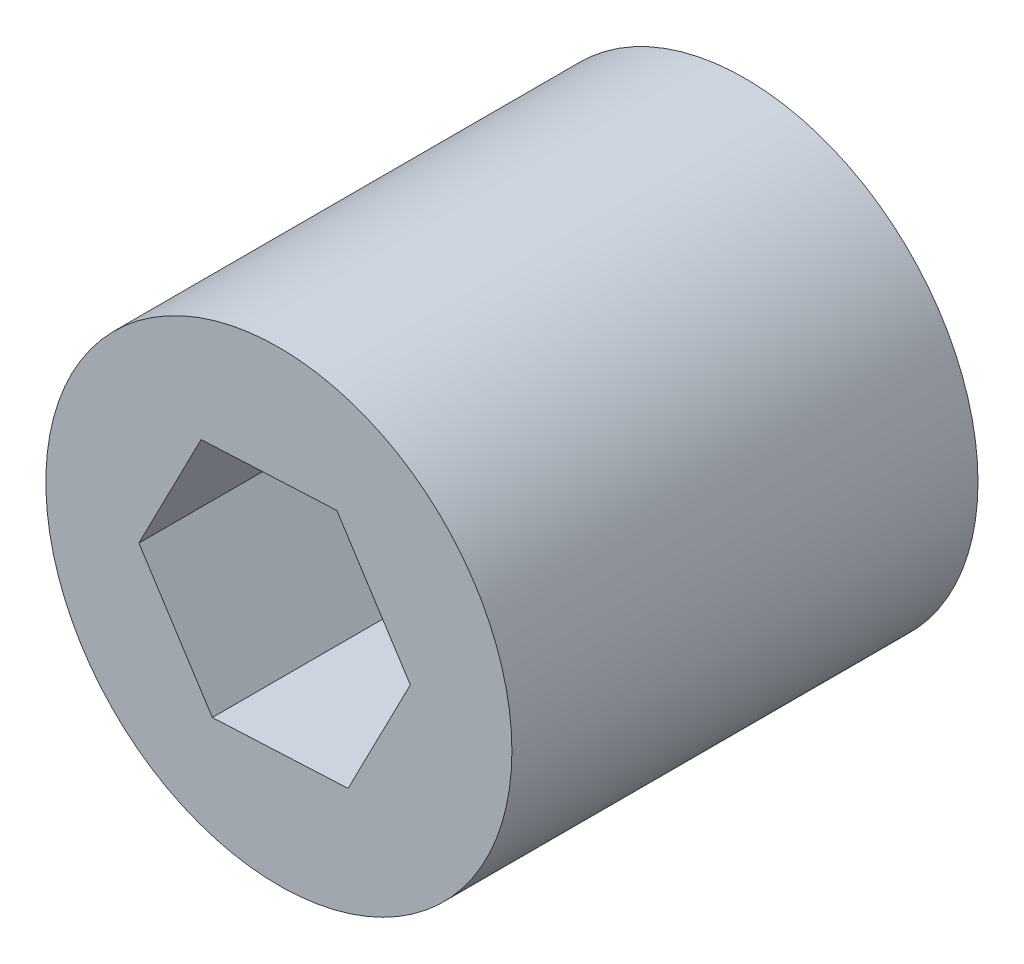
ISO-10303-21;
HEADER;
FILE_DESCRIPTION(('STEP AP214'),'2;1');
FILE_NAME('part.step','',(''),(''),'','','');
FILE_SCHEMA(('AUTOMOTIVE_DESIGN { 1 0 10303 214 1 1 1 1 }'));
ENDSEC;
DATA;
#1=APPLICATION_CONTEXT('core data for automotive mechanical design processes');
#2=APPLICATION_PROTOCOL_DEFINITION('international standard','automotive_design',2000,#1);
#3=PRODUCT_CONTEXT('',#1,'mechanical');
#4=PRODUCT('Part','Part','',(#3));
#5=PRODUCT_RELATED_PRODUCT_CATEGORY('part','',(#4));
#6=PRODUCT_DEFINITION_FORMATION('','',#4);
#7=PRODUCT_DEFINITION_CONTEXT('part definition',#1,'design');
#8=PRODUCT_DEFINITION('design','',#6,#7);
#9=PRODUCT_DEFINITION_SHAPE('','',#8);
#10=(LENGTH_UNIT() NAMED_UNIT(*) SI_UNIT(.MILLI.,.METRE.));
#11=(NAMED_UNIT(*) PLANE_ANGLE_UNIT() SI_UNIT($,.RADIAN.));
#12=(NAMED_UNIT(*) SI_UNIT($,.STERADIAN.) SOLID_ANGLE_UNIT());
#13=UNCERTAINTY_MEASURE_WITH_UNIT(LENGTH_MEASURE(1.E-05),#10,'distance_accuracy_value','');
#14=(GEOMETRIC_REPRESENTATION_CONTEXT(3) GLOBAL_UNCERTAINTY_ASSIGNED_CONTEXT((#13)) GLOBAL_UNIT_ASSIGNED_CONTEXT((#10,
#11,#12)) REPRESENTATION_CONTEXT('',''));
#15=CARTESIAN_POINT('',(0.,0.,0.));
#16=DIRECTION('',(0.,0.,1.));
#17=DIRECTION('',(1.,0.,0.));
#18=AXIS2_PLACEMENT_3D('',#15,#16,#17);
#19=CARTESIAN_POINT('',(0.,0.,25.4));
#20=DIRECTION('',(0.,0.,1.));
#21=DIRECTION('',(1.,0.,0.));
#22=AXIS2_PLACEMENT_3D('',#19,#20,#21);
#23=PLANE('',#22);
#24=CARTESIAN_POINT('',(0.,0.,25.4));
#25=DIRECTION('',(0.,0.,1.));
#26=DIRECTION('',(1.,0.,0.));
#27=AXIS2_PLACEMENT_3D('',#24,#25,#26);
#28=CIRCLE('',#27,12.7);
#29=CARTESIAN_POINT('',(12.7,0.,25.4));
#30=VERTEX_POINT('',#29);
#31=EDGE_CURVE('E12',#30,#30,#28,.T.);
#32=ORIENTED_EDGE('',*,*,#31,.T.);
#33=EDGE_LOOP('',(#32));
#34=FACE_BOUND('',#33,.T.);
#35=DIRECTION('',(0.998869935247953,0.0475273863972244,0.));
#36=VECTOR('',#35,1.);
#37=CARTESIAN_POINT('',(-3.626945327239,-6.58223844474275,25.4));
#38=LINE('',#37,#36);
#39=CARTESIAN_POINT('',(-3.626945327239,-6.58223844474275,25.4));
#40=VERTEX_POINT('',#39);
#41=CARTESIAN_POINT('',(3.77035768687366,-6.23026621468277,25.4));
#42=VERTEX_POINT('',#41);
#43=EDGE_CURVE('E116',#40,#42,#38,.T.);
#44=ORIENTED_EDGE('',*,*,#43,.F.);
#45=DIRECTION('',(0.540594891619451,-0.841283045802632,0.));
#46=VECTOR('',#45,1.);
#47=CARTESIAN_POINT('',(-7.63041372695392,-0.351972230059975,25.4));
#48=LINE('',#47,#46);
#49=CARTESIAN_POINT('',(-7.63041372695392,-0.351972230059975,25.4));
#50=VERTEX_POINT('',#49);
#51=EDGE_CURVE('E108',#50,#40,#48,.T.);
#52=ORIENTED_EDGE('',*,*,#51,.F.);
#53=DIRECTION('',(-0.458275043628501,-0.888810432199856,0.));
#54=VECTOR('',#53,1.);
#55=CARTESIAN_POINT('',(-4.23657911255619,6.23026621468277,25.4));
#56=LINE('',#55,#54);
#57=CARTESIAN_POINT('',(-4.23657911255619,6.23026621468277,25.4));
#58=VERTEX_POINT('',#57);
#59=EDGE_CURVE('E136',#58,#50,#56,.T.);
#60=ORIENTED_EDGE('',*,*,#59,.F.);
#61=DIRECTION('',(-0.998869935247953,-0.0475273863972243,0.));
#62=VECTOR('',#61,1.);
#63=CARTESIAN_POINT('',(3.16072390155646,6.58223844474275,25.4));
#64=LINE('',#63,#62);
#65=CARTESIAN_POINT('',(3.16072390155646,6.58223844474275,25.4));
#66=VERTEX_POINT('',#65);
#67=EDGE_CURVE('E134',#66,#58,#64,.T.);
#68=ORIENTED_EDGE('',*,*,#67,.F.);
#69=DIRECTION('',(-0.540594891619452,0.841283045802632,0.));
#70=VECTOR('',#69,1.);
#71=CARTESIAN_POINT('',(7.16419230127139,0.351972230059972,25.4));
#72=LINE('',#71,#70);
#73=CARTESIAN_POINT('',(7.16419230127139,0.351972230059972,25.4));
#74=VERTEX_POINT('',#73);
#75=EDGE_CURVE('E130',#74,#66,#72,.T.);
#76=ORIENTED_EDGE('',*,*,#75,.F.);
#77=DIRECTION('',(0.458275043628501,0.888810432199856,0.));
#78=VECTOR('',#77,1.);
#79=CARTESIAN_POINT('',(3.77035768687366,-6.23026621468277,25.4));
#80=LINE('',#79,#78);
#81=EDGE_CURVE('E128',#42,#74,#80,.T.);
#82=ORIENTED_EDGE('',*,*,#81,.F.);
#83=EDGE_LOOP('',(#44,#52,#60,#68,#76,#82));
#84=FACE_BOUND('',#83,.T.);
#85=ADVANCED_FACE('F55',(#34,#84),#23,.T.);
#86=CARTESIAN_POINT('',(0.,0.,0.));
#87=DIRECTION('',(0.,0.,1.));
#88=DIRECTION('',(1.,0.,0.));
#89=AXIS2_PLACEMENT_3D('',#86,#87,#88);
#90=PLANE('',#89);
#91=CARTESIAN_POINT('',(0.,0.,0.));
#92=DIRECTION('',(0.,0.,1.));
#93=DIRECTION('',(1.,0.,0.));
#94=AXIS2_PLACEMENT_3D('',#91,#92,#93);
#95=CIRCLE('',#94,12.7);
#96=CARTESIAN_POINT('',(12.7,0.,0.));
#97=VERTEX_POINT('',#96);
#98=EDGE_CURVE('E59',#97,#97,#95,.T.);
#99=ORIENTED_EDGE('',*,*,#98,.F.);
#100=EDGE_LOOP('',(#99));
#101=FACE_BOUND('',#100,.T.);
#102=DIRECTION('',(0.540594891619451,-0.841283045802632,0.));
#103=VECTOR('',#102,1.);
#104=CARTESIAN_POINT('',(-7.63041372695392,-0.351972230059975,0.));
#105=LINE('',#104,#103);
#106=CARTESIAN_POINT('',(-7.63041372695392,-0.351972230059976,0.));
#107=VERTEX_POINT('',#106);
#108=CARTESIAN_POINT('',(-3.626945327239,-6.58223844474275,0.));
#109=VERTEX_POINT('',#108);
#110=EDGE_CURVE('E78',#107,#109,#105,.T.);
#111=ORIENTED_EDGE('',*,*,#110,.T.);
#112=DIRECTION('',(0.998869935247953,0.0475273863972244,0.));
#113=VECTOR('',#112,1.);
#114=CARTESIAN_POINT('',(-3.626945327239,-6.58223844474275,0.));
#115=LINE('',#114,#113);
#116=CARTESIAN_POINT('',(3.77035768687366,-6.23026621468277,0.));
#117=VERTEX_POINT('',#116);
#118=EDGE_CURVE('E123',#109,#117,#115,.T.);
#119=ORIENTED_EDGE('',*,*,#118,.T.);
#120=DIRECTION('',(0.458275043628501,0.888810432199856,0.));
#121=VECTOR('',#120,1.);
#122=CARTESIAN_POINT('',(3.77035768687366,-6.23026621468277,0.));
#123=LINE('',#122,#121);
#124=CARTESIAN_POINT('',(7.16419230127139,0.351972230059972,0.));
#125=VERTEX_POINT('',#124);
#126=EDGE_CURVE('E140',#117,#125,#123,.T.);
#127=ORIENTED_EDGE('',*,*,#126,.T.);
#128=DIRECTION('',(-0.540594891619452,0.841283045802632,0.));
#129=VECTOR('',#128,1.);
#130=CARTESIAN_POINT('',(7.16419230127139,0.351972230059972,0.));
#131=LINE('',#130,#129);
#132=CARTESIAN_POINT('',(3.16072390155646,6.58223844474275,0.));
#133=VERTEX_POINT('',#132);
#134=EDGE_CURVE('E143',#125,#133,#131,.T.);
#135=ORIENTED_EDGE('',*,*,#134,.T.);
#136=DIRECTION('',(-0.998869935247953,-0.0475273863972243,0.));
#137=VECTOR('',#136,1.);
#138=CARTESIAN_POINT('',(3.16072390155646,6.58223844474275,0.));
#139=LINE('',#138,#137);
#140=CARTESIAN_POINT('',(-4.23657911255619,6.23026621468277,0.));
#141=VERTEX_POINT('',#140);
#142=EDGE_CURVE('E146',#133,#141,#139,.T.);
#143=ORIENTED_EDGE('',*,*,#142,.T.);
#144=DIRECTION('',(-0.458275043628501,-0.888810432199856,0.));
#145=VECTOR('',#144,1.);
#146=CARTESIAN_POINT('',(-4.23657911255619,6.23026621468277,0.));
#147=LINE('',#146,#145);
#148=EDGE_CURVE('E117',#141,#107,#147,.T.);
#149=ORIENTED_EDGE('',*,*,#148,.T.);
#150=EDGE_LOOP('',(#111,#119,#127,#135,#143,#149));
#151=FACE_BOUND('',#150,.T.);
#152=ADVANCED_FACE('F163',(#101,#151),#90,.F.);
#153=CARTESIAN_POINT('',(0.,0.,25.4));
#154=DIRECTION('',(0.,0.,-1.));
#155=DIRECTION('',(-1.,0.,0.));
#156=AXIS2_PLACEMENT_3D('',#153,#154,#155);
#157=CYLINDRICAL_SURFACE('',#156,12.7);
#158=ORIENTED_EDGE('',*,*,#31,.F.);
#159=EDGE_LOOP('',(#158));
#160=FACE_BOUND('',#159,.T.);
#161=ORIENTED_EDGE('',*,*,#98,.T.);
#162=EDGE_LOOP('',(#161));
#163=FACE_BOUND('',#162,.T.);
#164=ADVANCED_FACE('F57',(#160,#163),#157,.T.);
#165=CARTESIAN_POINT('',(-7.63041372695392,-0.351972230059975,25.4));
#166=DIRECTION('',(0.841283045802632,0.540594891619451,0.));
#167=DIRECTION('',(-0.540594891619451,0.841283045802632,0.));
#168=AXIS2_PLACEMENT_3D('',#165,#166,#167);
#169=PLANE('',#168);
#170=ORIENTED_EDGE('',*,*,#110,.F.);
#171=DIRECTION('',(0.,0.,-1.));
#172=VECTOR('',#171,1.);
#173=CARTESIAN_POINT('',(-7.63041372695392,-0.351972230059975,25.4));
#174=LINE('',#173,#172);
#175=EDGE_CURVE('E112',#50,#107,#174,.T.);
#176=ORIENTED_EDGE('',*,*,#175,.F.);
#177=ORIENTED_EDGE('',*,*,#51,.T.);
#178=DIRECTION('',(0.,0.,-1.));
#179=VECTOR('',#178,1.);
#180=CARTESIAN_POINT('',(-3.626945327239,-6.58223844474275,25.4));
#181=LINE('',#180,#179);
#182=EDGE_CURVE('E111',#40,#109,#181,.T.);
#183=ORIENTED_EDGE('',*,*,#182,.T.);
#184=EDGE_LOOP('',(#170,#176,#177,#183));
#185=FACE_BOUND('',#184,.T.);
#186=ADVANCED_FACE('F110',(#185),#169,.T.);
#187=CARTESIAN_POINT('',(-3.626945327239,-6.58223844474275,25.4));
#188=DIRECTION('',(-0.0475273863972244,0.998869935247953,0.));
#189=DIRECTION('',(-0.998869935247953,-0.0475273863972244,0.));
#190=AXIS2_PLACEMENT_3D('',#187,#188,#189);
#191=PLANE('',#190);
#192=ORIENTED_EDGE('',*,*,#118,.F.);
#193=ORIENTED_EDGE('',*,*,#182,.F.);
#194=ORIENTED_EDGE('',*,*,#43,.T.);
#195=DIRECTION('',(0.,0.,-1.));
#196=VECTOR('',#195,1.);
#197=CARTESIAN_POINT('',(3.77035768687366,-6.23026621468277,25.4));
#198=LINE('',#197,#196);
#199=EDGE_CURVE('E124',#42,#117,#198,.T.);
#200=ORIENTED_EDGE('',*,*,#199,.T.);
#201=EDGE_LOOP('',(#192,#193,#194,#200));
#202=FACE_BOUND('',#201,.T.);
#203=ADVANCED_FACE('F120',(#202),#191,.T.);
#204=CARTESIAN_POINT('',(3.77035768687366,-6.23026621468277,25.4));
#205=DIRECTION('',(-0.888810432199856,0.458275043628501,0.));
#206=DIRECTION('',(-0.458275043628501,-0.888810432199856,0.));
#207=AXIS2_PLACEMENT_3D('',#204,#205,#206);
#208=PLANE('',#207);
#209=ORIENTED_EDGE('',*,*,#126,.F.);
#210=ORIENTED_EDGE('',*,*,#199,.F.);
#211=ORIENTED_EDGE('',*,*,#81,.T.);
#212=DIRECTION('',(0.,0.,-1.));
#213=VECTOR('',#212,1.);
#214=CARTESIAN_POINT('',(7.16419230127139,0.351972230059972,25.4));
#215=LINE('',#214,#213);
#216=EDGE_CURVE('E155',#74,#125,#215,.T.);
#217=ORIENTED_EDGE('',*,*,#216,.T.);
#218=EDGE_LOOP('',(#209,#210,#211,#217));
#219=FACE_BOUND('',#218,.T.);
#220=ADVANCED_FACE('F159',(#219),#208,.T.);
#221=CARTESIAN_POINT('',(7.16419230127139,0.351972230059972,25.4));
#222=DIRECTION('',(-0.841283045802632,-0.540594891619452,0.));
#223=DIRECTION('',(0.540594891619452,-0.841283045802632,0.));
#224=AXIS2_PLACEMENT_3D('',#221,#222,#223);
#225=PLANE('',#224);
#226=ORIENTED_EDGE('',*,*,#134,.F.);
#227=ORIENTED_EDGE('',*,*,#216,.F.);
#228=ORIENTED_EDGE('',*,*,#75,.T.);
#229=DIRECTION('',(0.,0.,-1.));
#230=VECTOR('',#229,1.);
#231=CARTESIAN_POINT('',(3.16072390155646,6.58223844474275,25.4));
#232=LINE('',#231,#230);
#233=EDGE_CURVE('E153',#66,#133,#232,.T.);
#234=ORIENTED_EDGE('',*,*,#233,.T.);
#235=EDGE_LOOP('',(#226,#227,#228,#234));
#236=FACE_BOUND('',#235,.T.);
#237=ADVANCED_FACE('F171',(#236),#225,.T.);
#238=CARTESIAN_POINT('',(3.16072390155646,6.58223844474275,25.4));
#239=DIRECTION('',(0.0475273863972243,-0.998869935247953,0.));
#240=DIRECTION('',(0.998869935247953,0.0475273863972243,0.));
#241=AXIS2_PLACEMENT_3D('',#238,#239,#240);
#242=PLANE('',#241);
#243=ORIENTED_EDGE('',*,*,#142,.F.);
#244=ORIENTED_EDGE('',*,*,#233,.F.);
#245=ORIENTED_EDGE('',*,*,#67,.T.);
#246=DIRECTION('',(0.,0.,-1.));
#247=VECTOR('',#246,1.);
#248=CARTESIAN_POINT('',(-4.23657911255619,6.23026621468277,25.4));
#249=LINE('',#248,#247);
#250=EDGE_CURVE('E70',#58,#141,#249,.T.);
#251=ORIENTED_EDGE('',*,*,#250,.T.);
#252=EDGE_LOOP('',(#243,#244,#245,#251));
#253=FACE_BOUND('',#252,.T.);
#254=ADVANCED_FACE('F169',(#253),#242,.T.);
#255=CARTESIAN_POINT('',(-4.23657911255619,6.23026621468277,25.4));
#256=DIRECTION('',(0.888810432199856,-0.458275043628501,0.));
#257=DIRECTION('',(0.458275043628501,0.888810432199856,0.));
#258=AXIS2_PLACEMENT_3D('',#255,#256,#257);
#259=PLANE('',#258);
#260=ORIENTED_EDGE('',*,*,#148,.F.);
#261=ORIENTED_EDGE('',*,*,#250,.F.);
#262=ORIENTED_EDGE('',*,*,#59,.T.);
#263=ORIENTED_EDGE('',*,*,#175,.T.);
#264=EDGE_LOOP('',(#260,#261,#262,#263));
#265=FACE_BOUND('',#264,.T.);
#266=ADVANCED_FACE('F165',(#265),#259,.T.);
#267=CLOSED_SHELL('',(#85,#152,#164,#186,#203,#220,#237,#254,#266));
#268=MANIFOLD_SOLID_BREP('B2',#267);
#269=ADVANCED_BREP_SHAPE_REPRESENTATION('',(#18,#268),#14);
#270=SHAPE_DEFINITION_REPRESENTATION(#9,#269);
ENDSEC;
END-ISO-10303-21;
